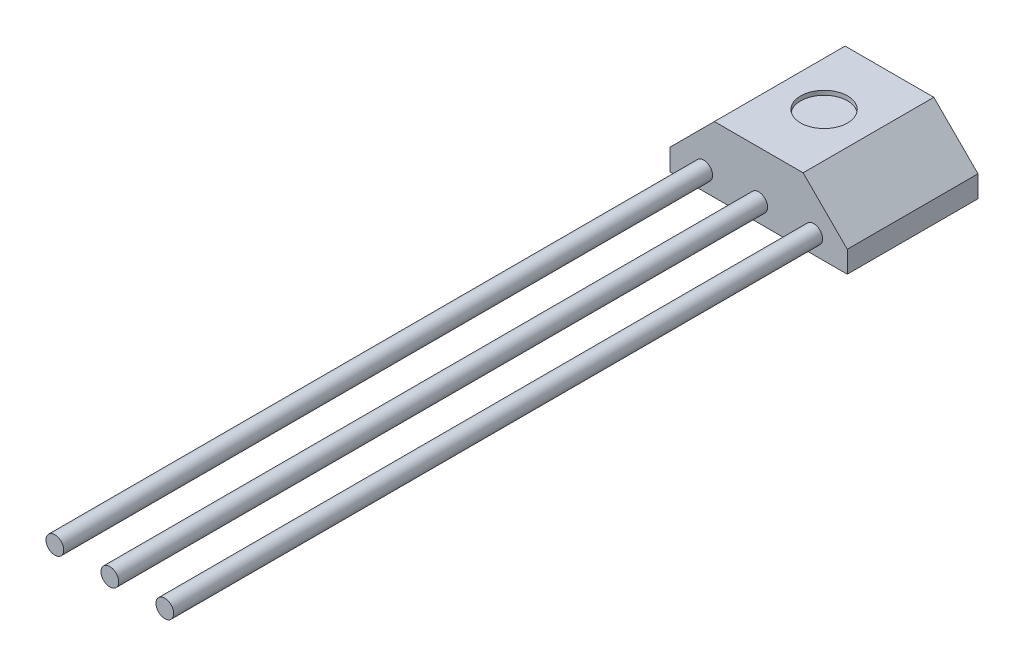
ISO-10303-21;
HEADER;
FILE_DESCRIPTION(('STEP AP214'),'2;1');
FILE_NAME('part.step','',(''),(''),'','','');
FILE_SCHEMA(('AUTOMOTIVE_DESIGN { 1 0 10303 214 1 1 1 1 }'));
ENDSEC;
DATA;
#1=APPLICATION_CONTEXT('core data for automotive mechanical design processes');
#2=APPLICATION_PROTOCOL_DEFINITION('international standard','automotive_design',2000,#1);
#3=PRODUCT_CONTEXT('',#1,'mechanical');
#4=PRODUCT('Part','Part','',(#3));
#5=PRODUCT_RELATED_PRODUCT_CATEGORY('part','',(#4));
#6=PRODUCT_DEFINITION_FORMATION('','',#4);
#7=PRODUCT_DEFINITION_CONTEXT('part definition',#1,'design');
#8=PRODUCT_DEFINITION('design','',#6,#7);
#9=PRODUCT_DEFINITION_SHAPE('','',#8);
#10=(LENGTH_UNIT() NAMED_UNIT(*) SI_UNIT(.MILLI.,.METRE.));
#11=(NAMED_UNIT(*) PLANE_ANGLE_UNIT() SI_UNIT($,.RADIAN.));
#12=(NAMED_UNIT(*) SI_UNIT($,.STERADIAN.) SOLID_ANGLE_UNIT());
#13=UNCERTAINTY_MEASURE_WITH_UNIT(LENGTH_MEASURE(1.E-05),#10,'distance_accuracy_value','');
#14=(GEOMETRIC_REPRESENTATION_CONTEXT(3) GLOBAL_UNCERTAINTY_ASSIGNED_CONTEXT((#13)) GLOBAL_UNIT_ASSIGNED_CONTEXT((#10,
#11,#12)) REPRESENTATION_CONTEXT('',''));
#15=CARTESIAN_POINT('',(0.,0.,0.));
#16=DIRECTION('',(0.,0.,1.));
#17=DIRECTION('',(1.,0.,0.));
#18=AXIS2_PLACEMENT_3D('',#15,#16,#17);
#19=CARTESIAN_POINT('',(7.67061052211858,30.6476317346096,14.99));
#20=DIRECTION('',(0.,0.,-1.));
#21=DIRECTION('',(-1.,0.,0.));
#22=AXIS2_PLACEMENT_3D('',#19,#20,#21);
#23=CYLINDRICAL_SURFACE('',#22,0.205);
#24=CARTESIAN_POINT('',(7.67061052211858,30.6476317346096,14.99));
#25=DIRECTION('',(0.,0.,1.));
#26=DIRECTION('',(1.,0.,0.));
#27=AXIS2_PLACEMENT_3D('',#24,#25,#26);
#28=CIRCLE('',#27,0.205);
#29=CARTESIAN_POINT('',(7.87561052211858,30.6476317346096,14.99));
#30=VERTEX_POINT('',#29);
#31=EDGE_CURVE('P0_E10',#30,#30,#28,.T.);
#32=ORIENTED_EDGE('',*,*,#31,.F.);
#33=EDGE_LOOP('',(#32));
#34=FACE_BOUND('',#33,.T.);
#35=CARTESIAN_POINT('',(7.67061052211858,30.6476317346096,0.));
#36=DIRECTION('',(0.,0.,1.));
#37=DIRECTION('',(1.,0.,0.));
#38=AXIS2_PLACEMENT_3D('',#35,#36,#37);
#39=CIRCLE('',#38,0.205);
#40=CARTESIAN_POINT('',(7.87561052211858,30.6476317346096,0.));
#41=VERTEX_POINT('',#40);
#42=EDGE_CURVE('P0_E18',#41,#41,#39,.T.);
#43=ORIENTED_EDGE('',*,*,#42,.T.);
#44=EDGE_LOOP('',(#43));
#45=FACE_BOUND('',#44,.T.);
#46=ADVANCED_FACE('P0_F15',(#34,#45),#23,.T.);
#47=CARTESIAN_POINT('',(6.40061052211856,30.9865106012478,14.99));
#48=DIRECTION('',(0.,0.,1.));
#49=DIRECTION('',(1.,0.,0.));
#50=AXIS2_PLACEMENT_3D('',#47,#48,#49);
#51=PLANE('',#50);
#52=ORIENTED_EDGE('',*,*,#31,.T.);
#53=EDGE_LOOP('',(#52));
#54=FACE_BOUND('',#53,.T.);
#55=ADVANCED_FACE('P0_F36',(#54),#51,.T.);
#56=CARTESIAN_POINT('',(6.40061052211856,30.9865106012478,0.));
#57=DIRECTION('',(0.,0.,1.));
#58=DIRECTION('',(1.,0.,0.));
#59=AXIS2_PLACEMENT_3D('',#56,#57,#58);
#60=PLANE('',#59);
#61=ORIENTED_EDGE('',*,*,#42,.F.);
#62=EDGE_LOOP('',(#61));
#63=FACE_BOUND('',#62,.T.);
#64=ADVANCED_FACE('P0_F34',(#63),#60,.F.);
#65=CLOSED_SHELL('',(#46,#55,#64));
#66=MANIFOLD_SOLID_BREP('P0_B1',#65);
#67=CARTESIAN_POINT('',(5.13061052211858,30.6476317346096,14.99));
#68=DIRECTION('',(0.,0.,-1.));
#69=DIRECTION('',(-1.,0.,0.));
#70=AXIS2_PLACEMENT_3D('',#67,#68,#69);
#71=CYLINDRICAL_SURFACE('',#70,0.205);
#72=CARTESIAN_POINT('',(5.13061052211858,30.6476317346096,14.99));
#73=DIRECTION('',(0.,0.,1.));
#74=DIRECTION('',(1.,0.,0.));
#75=AXIS2_PLACEMENT_3D('',#72,#73,#74);
#76=CIRCLE('',#75,0.205);
#77=CARTESIAN_POINT('',(5.33561052211858,30.6476317346096,14.99));
#78=VERTEX_POINT('',#77);
#79=EDGE_CURVE('P1_E10',#78,#78,#76,.T.);
#80=ORIENTED_EDGE('',*,*,#79,.F.);
#81=EDGE_LOOP('',(#80));
#82=FACE_BOUND('',#81,.T.);
#83=CARTESIAN_POINT('',(5.13061052211858,30.6476317346096,0.));
#84=DIRECTION('',(0.,0.,1.));
#85=DIRECTION('',(1.,0.,0.));
#86=AXIS2_PLACEMENT_3D('',#83,#84,#85);
#87=CIRCLE('',#86,0.205);
#88=CARTESIAN_POINT('',(5.33561052211858,30.6476317346096,0.));
#89=VERTEX_POINT('',#88);
#90=EDGE_CURVE('P1_E18',#89,#89,#87,.T.);
#91=ORIENTED_EDGE('',*,*,#90,.T.);
#92=EDGE_LOOP('',(#91));
#93=FACE_BOUND('',#92,.T.);
#94=ADVANCED_FACE('P1_F15',(#82,#93),#71,.T.);
#95=CARTESIAN_POINT('',(6.40061052211856,30.9865106012478,14.99));
#96=DIRECTION('',(0.,0.,1.));
#97=DIRECTION('',(1.,0.,0.));
#98=AXIS2_PLACEMENT_3D('',#95,#96,#97);
#99=PLANE('',#98);
#100=ORIENTED_EDGE('',*,*,#79,.T.);
#101=EDGE_LOOP('',(#100));
#102=FACE_BOUND('',#101,.T.);
#103=ADVANCED_FACE('P1_F36',(#102),#99,.T.);
#104=CARTESIAN_POINT('',(6.40061052211856,30.9865106012478,0.));
#105=DIRECTION('',(0.,0.,1.));
#106=DIRECTION('',(1.,0.,0.));
#107=AXIS2_PLACEMENT_3D('',#104,#105,#106);
#108=PLANE('',#107);
#109=ORIENTED_EDGE('',*,*,#90,.F.);
#110=EDGE_LOOP('',(#109));
#111=FACE_BOUND('',#110,.T.);
#112=ADVANCED_FACE('P1_F34',(#111),#108,.F.);
#113=CLOSED_SHELL('',(#94,#103,#112));
#114=MANIFOLD_SOLID_BREP('P1_B1',#113);
#115=CARTESIAN_POINT('',(6.40061052211856,30.6476317346096,14.99));
#116=DIRECTION('',(0.,0.,-1.));
#117=DIRECTION('',(-1.,0.,0.));
#118=AXIS2_PLACEMENT_3D('',#115,#116,#117);
#119=CYLINDRICAL_SURFACE('',#118,0.205);
#120=CARTESIAN_POINT('',(6.40061052211856,30.6476317346096,14.99));
#121=DIRECTION('',(0.,0.,1.));
#122=DIRECTION('',(1.,0.,0.));
#123=AXIS2_PLACEMENT_3D('',#120,#121,#122);
#124=CIRCLE('',#123,0.205);
#125=CARTESIAN_POINT('',(6.60561052211856,30.6476317346096,14.99));
#126=VERTEX_POINT('',#125);
#127=EDGE_CURVE('P2_E10',#126,#126,#124,.T.);
#128=ORIENTED_EDGE('',*,*,#127,.F.);
#129=EDGE_LOOP('',(#128));
#130=FACE_BOUND('',#129,.T.);
#131=CARTESIAN_POINT('',(6.40061052211856,30.6476317346096,0.));
#132=DIRECTION('',(0.,0.,1.));
#133=DIRECTION('',(1.,0.,0.));
#134=AXIS2_PLACEMENT_3D('',#131,#132,#133);
#135=CIRCLE('',#134,0.205);
#136=CARTESIAN_POINT('',(6.60561052211856,30.6476317346096,0.));
#137=VERTEX_POINT('',#136);
#138=EDGE_CURVE('P2_E18',#137,#137,#135,.T.);
#139=ORIENTED_EDGE('',*,*,#138,.T.);
#140=EDGE_LOOP('',(#139));
#141=FACE_BOUND('',#140,.T.);
#142=ADVANCED_FACE('P2_F15',(#130,#141),#119,.T.);
#143=CARTESIAN_POINT('',(6.40061052211856,30.9865106012478,14.99));
#144=DIRECTION('',(0.,0.,1.));
#145=DIRECTION('',(1.,0.,0.));
#146=AXIS2_PLACEMENT_3D('',#143,#144,#145);
#147=PLANE('',#146);
#148=ORIENTED_EDGE('',*,*,#127,.T.);
#149=EDGE_LOOP('',(#148));
#150=FACE_BOUND('',#149,.T.);
#151=ADVANCED_FACE('P2_F35',(#150),#147,.T.);
#152=CARTESIAN_POINT('',(6.40061052211856,30.9865106012478,0.));
#153=DIRECTION('',(0.,0.,1.));
#154=DIRECTION('',(1.,0.,0.));
#155=AXIS2_PLACEMENT_3D('',#152,#153,#154);
#156=PLANE('',#155);
#157=ORIENTED_EDGE('',*,*,#138,.F.);
#158=EDGE_LOOP('',(#157));
#159=FACE_BOUND('',#158,.T.);
#160=ADVANCED_FACE('P2_F33',(#159),#156,.F.);
#161=CLOSED_SHELL('',(#142,#151,#160));
#162=MANIFOLD_SOLID_BREP('P2_B1',#161);
#163=CARTESIAN_POINT('',(6.44503934159751,30.2265106012478,-3.02));
#164=DIRECTION('',(0.,-1.,0.));
#165=DIRECTION('',(1.,0.,0.));
#166=AXIS2_PLACEMENT_3D('',#163,#164,#165);
#167=PLANE('',#166);
#168=DIRECTION('',(1.,0.,0.));
#169=VECTOR('',#168,1.);
#170=CARTESIAN_POINT('',(6.44503934159751,30.2265106012478,0.));
#171=LINE('',#170,#169);
#172=CARTESIAN_POINT('',(4.35561052211856,30.2265106012478,0.));
#173=VERTEX_POINT('',#172);
#174=CARTESIAN_POINT('',(8.44561052211856,30.2265106012478,0.));
#175=VERTEX_POINT('',#174);
#176=EDGE_CURVE('P3_E210',#173,#175,#171,.T.);
#177=ORIENTED_EDGE('',*,*,#176,.F.);
#178=DIRECTION('',(0.,0.,1.));
#179=VECTOR('',#178,1.);
#180=CARTESIAN_POINT('',(4.35561052211856,30.2265106012478,-3.02));
#181=LINE('',#180,#179);
#182=CARTESIAN_POINT('',(4.35561052211856,30.2265106012478,-3.02));
#183=VERTEX_POINT('',#182);
#184=EDGE_CURVE('P3_E26',#183,#173,#181,.T.);
#185=ORIENTED_EDGE('',*,*,#184,.F.);
#186=DIRECTION('',(1.,0.,0.));
#187=VECTOR('',#186,1.);
#188=CARTESIAN_POINT('',(6.44503934159751,30.2265106012478,-3.02));
#189=LINE('',#188,#187);
#190=CARTESIAN_POINT('',(8.44561052211856,30.2265106012478,-3.02));
#191=VERTEX_POINT('',#190);
#192=EDGE_CURVE('P3_E186',#183,#191,#189,.T.);
#193=ORIENTED_EDGE('',*,*,#192,.T.);
#194=DIRECTION('',(0.,0.,1.));
#195=VECTOR('',#194,1.);
#196=CARTESIAN_POINT('',(8.44561052211856,30.2265106012478,-3.02));
#197=LINE('',#196,#195);
#198=EDGE_CURVE('P3_E233',#191,#175,#197,.T.);
#199=ORIENTED_EDGE('',*,*,#198,.T.);
#200=EDGE_LOOP('',(#177,#185,#193,#199));
#201=FACE_BOUND('',#200,.T.);
#202=DIRECTION('',(1.,0.,0.));
#203=VECTOR('',#202,1.);
#204=CARTESIAN_POINT('',(6.40061052211856,30.2265106012478,-2.47480696998536));
#205=LINE('',#204,#203);
#206=CARTESIAN_POINT('',(4.79791965335607,30.2265106012478,-2.47480696998536));
#207=VERTEX_POINT('',#206);
#208=CARTESIAN_POINT('',(8.00330139088105,30.2265106012478,-2.47480696998536));
#209=VERTEX_POINT('',#208);
#210=EDGE_CURVE('P3_E158',#207,#209,#205,.T.);
#211=ORIENTED_EDGE('',*,*,#210,.F.);
#212=DIRECTION('',(0.,0.,1.));
#213=VECTOR('',#212,1.);
#214=CARTESIAN_POINT('',(4.79791965335607,30.2265106012478,-1.41354801598936));
#215=LINE('',#214,#213);
#216=CARTESIAN_POINT('',(4.79791965335607,30.2265106012478,-0.352289061993361));
#217=VERTEX_POINT('',#216);
#218=EDGE_CURVE('P3_E38',#207,#217,#215,.T.);
#219=ORIENTED_EDGE('',*,*,#218,.T.);
#220=DIRECTION('',(1.,0.,0.));
#221=VECTOR('',#220,1.);
#222=CARTESIAN_POINT('',(6.40061052211856,30.2265106012478,-0.352289061993361));
#223=LINE('',#222,#221);
#224=CARTESIAN_POINT('',(8.00330139088105,30.2265106012478,-0.352289061993361));
#225=VERTEX_POINT('',#224);
#226=EDGE_CURVE('P3_E45',#217,#225,#223,.T.);
#227=ORIENTED_EDGE('',*,*,#226,.T.);
#228=DIRECTION('',(0.,0.,1.));
#229=VECTOR('',#228,1.);
#230=CARTESIAN_POINT('',(8.00330139088105,30.2265106012478,-1.41354801598936));
#231=LINE('',#230,#229);
#232=EDGE_CURVE('P3_E149',#209,#225,#231,.T.);
#233=ORIENTED_EDGE('',*,*,#232,.F.);
#234=EDGE_LOOP('',(#211,#219,#227,#233));
#235=FACE_BOUND('',#234,.T.);
#236=ADVANCED_FACE('P3_F17',(#201,#235),#167,.T.);
#237=CARTESIAN_POINT('',(4.83826239908289,31.2091624782122,-3.02));
#238=DIRECTION('',(-0.707106781186548,0.707106781186547,0.));
#239=DIRECTION('',(-0.707106781186547,-0.707106781186548,0.));
#240=AXIS2_PLACEMENT_3D('',#237,#238,#239);
#241=PLANE('',#240);
#242=DIRECTION('',(-0.707106781186547,-0.707106781186548,0.));
#243=VECTOR('',#242,1.);
#244=CARTESIAN_POINT('',(4.83826239908289,31.2091624782122,0.));
#245=LINE('',#244,#243);
#246=CARTESIAN_POINT('',(5.37561052211856,31.7465106012478,0.));
#247=VERTEX_POINT('',#246);
#248=CARTESIAN_POINT('',(4.35561052211856,30.7265106012478,0.));
#249=VERTEX_POINT('',#248);
#250=EDGE_CURVE('P3_E173',#247,#249,#245,.T.);
#251=ORIENTED_EDGE('',*,*,#250,.F.);
#252=DIRECTION('',(0.,0.,1.));
#253=VECTOR('',#252,1.);
#254=CARTESIAN_POINT('',(5.37561052211856,31.7465106012478,-3.02));
#255=LINE('',#254,#253);
#256=CARTESIAN_POINT('',(5.37561052211856,31.7465106012478,-3.02));
#257=VERTEX_POINT('',#256);
#258=EDGE_CURVE('P3_E202',#257,#247,#255,.T.);
#259=ORIENTED_EDGE('',*,*,#258,.F.);
#260=DIRECTION('',(-0.707106781186547,-0.707106781186548,0.));
#261=VECTOR('',#260,1.);
#262=CARTESIAN_POINT('',(4.83826239908289,31.2091624782122,-3.02));
#263=LINE('',#262,#261);
#264=CARTESIAN_POINT('',(4.35561052211856,30.7265106012478,-3.02));
#265=VERTEX_POINT('',#264);
#266=EDGE_CURVE('P3_E177',#257,#265,#263,.T.);
#267=ORIENTED_EDGE('',*,*,#266,.T.);
#268=DIRECTION('',(0.,0.,1.));
#269=VECTOR('',#268,1.);
#270=CARTESIAN_POINT('',(4.35561052211856,30.7265106012478,-3.02));
#271=LINE('',#270,#269);
#272=EDGE_CURVE('P3_E11',#265,#249,#271,.T.);
#273=ORIENTED_EDGE('',*,*,#272,.T.);
#274=EDGE_LOOP('',(#251,#259,#267,#273));
#275=FACE_BOUND('',#274,.T.);
#276=ADVANCED_FACE('P3_F19',(#275),#241,.T.);
#277=CARTESIAN_POINT('',(4.35561052211856,29.9818166694562,-3.02));
#278=DIRECTION('',(-1.,0.,0.));
#279=DIRECTION('',(0.,0.,1.));
#280=AXIS2_PLACEMENT_3D('',#277,#278,#279);
#281=PLANE('',#280);
#282=DIRECTION('',(0.,-1.,0.));
#283=VECTOR('',#282,1.);
#284=CARTESIAN_POINT('',(4.35561052211856,29.9818166694562,0.));
#285=LINE('',#284,#283);
#286=EDGE_CURVE('P3_E206',#249,#173,#285,.T.);
#287=ORIENTED_EDGE('',*,*,#286,.F.);
#288=ORIENTED_EDGE('',*,*,#272,.F.);
#289=DIRECTION('',(0.,-1.,0.));
#290=VECTOR('',#289,1.);
#291=CARTESIAN_POINT('',(4.35561052211856,29.9818166694562,-3.02));
#292=LINE('',#291,#290);
#293=EDGE_CURVE('P3_E181',#265,#183,#292,.T.);
#294=ORIENTED_EDGE('',*,*,#293,.T.);
#295=ORIENTED_EDGE('',*,*,#184,.T.);
#296=EDGE_LOOP('',(#287,#288,#294,#295));
#297=FACE_BOUND('',#296,.T.);
#298=ADVANCED_FACE('P3_F240',(#297),#281,.T.);
#299=CARTESIAN_POINT('',(8.44561052211856,30.0029307879281,-3.02));
#300=DIRECTION('',(1.,0.,0.));
#301=DIRECTION('',(0.,0.,-1.));
#302=AXIS2_PLACEMENT_3D('',#299,#300,#301);
#303=PLANE('',#302);
#304=DIRECTION('',(0.,1.,0.));
#305=VECTOR('',#304,1.);
#306=CARTESIAN_POINT('',(8.44561052211856,30.0029307879281,0.));
#307=LINE('',#306,#305);
#308=CARTESIAN_POINT('',(8.44561052211856,30.7265106012478,0.));
#309=VERTEX_POINT('',#308);
#310=EDGE_CURVE('P3_E214',#175,#309,#307,.T.);
#311=ORIENTED_EDGE('',*,*,#310,.F.);
#312=ORIENTED_EDGE('',*,*,#198,.F.);
#313=DIRECTION('',(0.,1.,0.));
#314=VECTOR('',#313,1.);
#315=CARTESIAN_POINT('',(8.44561052211856,30.0029307879281,-3.02));
#316=LINE('',#315,#314);
#317=CARTESIAN_POINT('',(8.44561052211856,30.7265106012478,-3.02));
#318=VERTEX_POINT('',#317);
#319=EDGE_CURVE('P3_E190',#191,#318,#316,.T.);
#320=ORIENTED_EDGE('',*,*,#319,.T.);
#321=DIRECTION('',(0.,0.,1.));
#322=VECTOR('',#321,1.);
#323=CARTESIAN_POINT('',(8.44561052211856,30.7265106012478,-3.02));
#324=LINE('',#323,#322);
#325=EDGE_CURVE('P3_E230',#318,#309,#324,.T.);
#326=ORIENTED_EDGE('',*,*,#325,.T.);
#327=EDGE_LOOP('',(#311,#312,#320,#326));
#328=FACE_BOUND('',#327,.T.);
#329=ADVANCED_FACE('P3_F257',(#328),#303,.T.);
#330=CARTESIAN_POINT('',(7.83431157235327,31.3378095510132,-3.02));
#331=DIRECTION('',(0.707106781186547,0.707106781186548,0.));
#332=DIRECTION('',(-0.707106781186548,0.707106781186547,0.));
#333=AXIS2_PLACEMENT_3D('',#330,#331,#332);
#334=PLANE('',#333);
#335=DIRECTION('',(-0.707106781186548,0.707106781186547,0.));
#336=VECTOR('',#335,1.);
#337=CARTESIAN_POINT('',(7.83431157235327,31.3378095510132,0.));
#338=LINE('',#337,#336);
#339=CARTESIAN_POINT('',(7.42561052211856,31.7465106012478,0.));
#340=VERTEX_POINT('',#339);
#341=EDGE_CURVE('P3_E218',#309,#340,#338,.T.);
#342=ORIENTED_EDGE('',*,*,#341,.F.);
#343=ORIENTED_EDGE('',*,*,#325,.F.);
#344=DIRECTION('',(-0.707106781186548,0.707106781186547,0.));
#345=VECTOR('',#344,1.);
#346=CARTESIAN_POINT('',(7.83431157235327,31.3378095510132,-3.02));
#347=LINE('',#346,#345);
#348=CARTESIAN_POINT('',(7.42561052211856,31.7465106012478,-3.02));
#349=VERTEX_POINT('',#348);
#350=EDGE_CURVE('P3_E194',#318,#349,#347,.T.);
#351=ORIENTED_EDGE('',*,*,#350,.T.);
#352=DIRECTION('',(0.,0.,1.));
#353=VECTOR('',#352,1.);
#354=CARTESIAN_POINT('',(7.42561052211856,31.7465106012478,-3.02));
#355=LINE('',#354,#353);
#356=EDGE_CURVE('P3_E227',#349,#340,#355,.T.);
#357=ORIENTED_EDGE('',*,*,#356,.T.);
#358=EDGE_LOOP('',(#342,#343,#351,#357));
#359=FACE_BOUND('',#358,.T.);
#360=ADVANCED_FACE('P3_F260',(#359),#334,.T.);
#361=CARTESIAN_POINT('',(6.42456134884818,31.7465106012478,-3.02));
#362=DIRECTION('',(0.,1.,0.));
#363=DIRECTION('',(-1.,0.,0.));
#364=AXIS2_PLACEMENT_3D('',#361,#362,#363);
#365=PLANE('',#364);
#366=CARTESIAN_POINT('',(6.40061052211856,31.7465106012478,-1.51));
#367=DIRECTION('',(0.,1.,0.));
#368=DIRECTION('',(-1.,0.,0.));
#369=AXIS2_PLACEMENT_3D('',#366,#367,#368);
#370=CIRCLE('',#369,0.54185155627086);
#371=CARTESIAN_POINT('',(5.8587589658477,31.7465106012478,-1.51));
#372=VERTEX_POINT('',#371);
#373=EDGE_CURVE('P3_E128',#372,#372,#370,.T.);
#374=ORIENTED_EDGE('',*,*,#373,.F.);
#375=EDGE_LOOP('',(#374));
#376=FACE_BOUND('',#375,.T.);
#377=DIRECTION('',(-1.,0.,0.));
#378=VECTOR('',#377,1.);
#379=CARTESIAN_POINT('',(6.42456134884818,31.7465106012478,0.));
#380=LINE('',#379,#378);
#381=EDGE_CURVE('P3_E182',#340,#247,#380,.T.);
#382=ORIENTED_EDGE('',*,*,#381,.F.);
#383=ORIENTED_EDGE('',*,*,#356,.F.);
#384=DIRECTION('',(-1.,0.,0.));
#385=VECTOR('',#384,1.);
#386=CARTESIAN_POINT('',(6.42456134884818,31.7465106012478,-3.02));
#387=LINE('',#386,#385);
#388=EDGE_CURVE('P3_E198',#349,#257,#387,.T.);
#389=ORIENTED_EDGE('',*,*,#388,.T.);
#390=ORIENTED_EDGE('',*,*,#258,.T.);
#391=EDGE_LOOP('',(#382,#383,#389,#390));
#392=FACE_BOUND('',#391,.T.);
#393=ADVANCED_FACE('P3_F262',(#376,#392),#365,.T.);
#394=CARTESIAN_POINT('',(6.40061052211856,30.9865106012478,-3.02));
#395=DIRECTION('',(0.,0.,1.));
#396=DIRECTION('',(1.,0.,0.));
#397=AXIS2_PLACEMENT_3D('',#394,#395,#396);
#398=PLANE('',#397);
#399=ORIENTED_EDGE('',*,*,#266,.F.);
#400=ORIENTED_EDGE('',*,*,#388,.F.);
#401=ORIENTED_EDGE('',*,*,#350,.F.);
#402=ORIENTED_EDGE('',*,*,#319,.F.);
#403=ORIENTED_EDGE('',*,*,#192,.F.);
#404=ORIENTED_EDGE('',*,*,#293,.F.);
#405=EDGE_LOOP('',(#399,#400,#401,#402,#403,#404));
#406=FACE_BOUND('',#405,.T.);
#407=ADVANCED_FACE('P3_F252',(#406),#398,.F.);
#408=CARTESIAN_POINT('',(6.40061052211856,30.9865106012478,0.));
#409=DIRECTION('',(0.,0.,1.));
#410=DIRECTION('',(1.,0.,0.));
#411=AXIS2_PLACEMENT_3D('',#408,#409,#410);
#412=PLANE('',#411);
#413=ORIENTED_EDGE('',*,*,#250,.T.);
#414=ORIENTED_EDGE('',*,*,#286,.T.);
#415=ORIENTED_EDGE('',*,*,#176,.T.);
#416=ORIENTED_EDGE('',*,*,#310,.T.);
#417=ORIENTED_EDGE('',*,*,#341,.T.);
#418=ORIENTED_EDGE('',*,*,#381,.T.);
#419=EDGE_LOOP('',(#413,#414,#415,#416,#417,#418));
#420=FACE_BOUND('',#419,.T.);
#421=ADVANCED_FACE('P3_F246',(#420),#412,.T.);
#422=CARTESIAN_POINT('',(6.40061052211856,31.6465106012478,-1.51));
#423=DIRECTION('',(0.,1.,0.));
#424=DIRECTION('',(-1.,0.,0.));
#425=AXIS2_PLACEMENT_3D('',#422,#423,#424);
#426=CYLINDRICAL_SURFACE('',#425,0.54185155627086);
#427=CARTESIAN_POINT('',(6.40061052211856,31.6465106012478,-1.51));
#428=DIRECTION('',(0.,1.,0.));
#429=DIRECTION('',(-1.,0.,0.));
#430=AXIS2_PLACEMENT_3D('',#427,#428,#429);
#431=CIRCLE('',#430,0.54185155627086);
#432=CARTESIAN_POINT('',(5.8587589658477,31.6465106012478,-1.51));
#433=VERTEX_POINT('',#432);
#434=EDGE_CURVE('P3_E169',#433,#433,#431,.T.);
#435=ORIENTED_EDGE('',*,*,#434,.F.);
#436=EDGE_LOOP('',(#435));
#437=FACE_BOUND('',#436,.T.);
#438=ORIENTED_EDGE('',*,*,#373,.T.);
#439=EDGE_LOOP('',(#438));
#440=FACE_BOUND('',#439,.T.);
#441=ADVANCED_FACE('P3_F318',(#437,#440),#426,.F.);
#442=CARTESIAN_POINT('',(6.40061052211856,31.6465106012478,-1.51));
#443=DIRECTION('',(0.,1.,0.));
#444=DIRECTION('',(-1.,0.,0.));
#445=AXIS2_PLACEMENT_3D('',#442,#443,#444);
#446=PLANE('',#445);
#447=ORIENTED_EDGE('',*,*,#434,.T.);
#448=EDGE_LOOP('',(#447));
#449=FACE_BOUND('',#448,.T.);
#450=ADVANCED_FACE('P3_F327',(#449),#446,.T.);
#451=CARTESIAN_POINT('',(4.79791965335607,30.2165106012478,-1.41354801598936));
#452=DIRECTION('',(-1.,0.,0.));
#453=DIRECTION('',(0.,-1.,0.));
#454=AXIS2_PLACEMENT_3D('',#451,#452,#453);
#455=PLANE('',#454);
#456=ORIENTED_EDGE('',*,*,#218,.F.);
#457=DIRECTION('',(0.,1.,0.));
#458=VECTOR('',#457,1.);
#459=CARTESIAN_POINT('',(4.79791965335607,30.2165106012478,-2.47480696998536));
#460=LINE('',#459,#458);
#461=CARTESIAN_POINT('',(4.79791965335607,30.2165106012478,-2.47480696998536));
#462=VERTEX_POINT('',#461);
#463=EDGE_CURVE('P3_E119',#462,#207,#460,.T.);
#464=ORIENTED_EDGE('',*,*,#463,.F.);
#465=DIRECTION('',(0.,0.,1.));
#466=VECTOR('',#465,1.);
#467=CARTESIAN_POINT('',(4.79791965335607,30.2165106012478,-1.41354801598936));
#468=LINE('',#467,#466);
#469=CARTESIAN_POINT('',(4.79791965335607,30.2165106012478,-0.352289061993361));
#470=VERTEX_POINT('',#469);
#471=EDGE_CURVE('P3_E123',#462,#470,#468,.T.);
#472=ORIENTED_EDGE('',*,*,#471,.T.);
#473=DIRECTION('',(0.,1.,0.));
#474=VECTOR('',#473,1.);
#475=CARTESIAN_POINT('',(4.79791965335607,30.2165106012478,-0.352289061993361));
#476=LINE('',#475,#474);
#477=EDGE_CURVE('P3_E155',#470,#217,#476,.T.);
#478=ORIENTED_EDGE('',*,*,#477,.T.);
#479=EDGE_LOOP('',(#456,#464,#472,#478));
#480=FACE_BOUND('',#479,.T.);
#481=ADVANCED_FACE('P3_F121',(#480),#455,.T.);
#482=CARTESIAN_POINT('',(6.40061052211856,30.2165106012478,-2.47480696998536));
#483=DIRECTION('',(0.,0.,1.));
#484=DIRECTION('',(1.,0.,0.));
#485=AXIS2_PLACEMENT_3D('',#482,#483,#484);
#486=PLANE('',#485);
#487=ORIENTED_EDGE('',*,*,#210,.T.);
#488=DIRECTION('',(0.,1.,0.));
#489=VECTOR('',#488,1.);
#490=CARTESIAN_POINT('',(8.00330139088105,30.2165106012478,-2.47480696998536));
#491=LINE('',#490,#489);
#492=CARTESIAN_POINT('',(8.00330139088105,30.2165106012478,-2.47480696998536));
#493=VERTEX_POINT('',#492);
#494=EDGE_CURVE('P3_E129',#493,#209,#491,.T.);
#495=ORIENTED_EDGE('',*,*,#494,.F.);
#496=DIRECTION('',(1.,0.,0.));
#497=VECTOR('',#496,1.);
#498=CARTESIAN_POINT('',(6.40061052211856,30.2165106012478,-2.47480696998536));
#499=LINE('',#498,#497);
#500=EDGE_CURVE('P3_E132',#462,#493,#499,.T.);
#501=ORIENTED_EDGE('',*,*,#500,.F.);
#502=ORIENTED_EDGE('',*,*,#463,.T.);
#503=EDGE_LOOP('',(#487,#495,#501,#502));
#504=FACE_BOUND('',#503,.T.);
#505=ADVANCED_FACE('P3_F133',(#504),#486,.F.);
#506=CARTESIAN_POINT('',(8.00330139088105,30.2165106012478,-1.41354801598936));
#507=DIRECTION('',(-1.,0.,0.));
#508=DIRECTION('',(0.,-1.,0.));
#509=AXIS2_PLACEMENT_3D('',#506,#507,#508);
#510=PLANE('',#509);
#511=ORIENTED_EDGE('',*,*,#232,.T.);
#512=DIRECTION('',(0.,1.,0.));
#513=VECTOR('',#512,1.);
#514=CARTESIAN_POINT('',(8.00330139088105,30.2165106012478,-0.352289061993361));
#515=LINE('',#514,#513);
#516=CARTESIAN_POINT('',(8.00330139088105,30.2165106012478,-0.352289061993361));
#517=VERTEX_POINT('',#516);
#518=EDGE_CURVE('P3_E164',#517,#225,#515,.T.);
#519=ORIENTED_EDGE('',*,*,#518,.F.);
#520=DIRECTION('',(0.,0.,1.));
#521=VECTOR('',#520,1.);
#522=CARTESIAN_POINT('',(8.00330139088105,30.2165106012478,-1.41354801598936));
#523=LINE('',#522,#521);
#524=EDGE_CURVE('P3_E138',#493,#517,#523,.T.);
#525=ORIENTED_EDGE('',*,*,#524,.F.);
#526=ORIENTED_EDGE('',*,*,#494,.T.);
#527=EDGE_LOOP('',(#511,#519,#525,#526));
#528=FACE_BOUND('',#527,.T.);
#529=ADVANCED_FACE('P3_F357',(#528),#510,.F.);
#530=CARTESIAN_POINT('',(6.40061052211856,30.2165106012478,-0.352289061993361));
#531=DIRECTION('',(0.,0.,1.));
#532=DIRECTION('',(1.,0.,0.));
#533=AXIS2_PLACEMENT_3D('',#530,#531,#532);
#534=PLANE('',#533);
#535=ORIENTED_EDGE('',*,*,#226,.F.);
#536=ORIENTED_EDGE('',*,*,#477,.F.);
#537=DIRECTION('',(1.,0.,0.));
#538=VECTOR('',#537,1.);
#539=CARTESIAN_POINT('',(6.40061052211856,30.2165106012478,-0.352289061993361));
#540=LINE('',#539,#538);
#541=EDGE_CURVE('P3_E142',#470,#517,#540,.T.);
#542=ORIENTED_EDGE('',*,*,#541,.T.);
#543=ORIENTED_EDGE('',*,*,#518,.T.);
#544=EDGE_LOOP('',(#535,#536,#542,#543));
#545=FACE_BOUND('',#544,.T.);
#546=ADVANCED_FACE('P3_F367',(#545),#534,.T.);
#547=CARTESIAN_POINT('',(6.40061052211856,30.2165106012478,-1.51));
#548=DIRECTION('',(0.,-1.,0.));
#549=DIRECTION('',(1.,0.,0.));
#550=AXIS2_PLACEMENT_3D('',#547,#548,#549);
#551=PLANE('',#550);
#552=ORIENTED_EDGE('',*,*,#471,.F.);
#553=ORIENTED_EDGE('',*,*,#500,.T.);
#554=ORIENTED_EDGE('',*,*,#524,.T.);
#555=ORIENTED_EDGE('',*,*,#541,.F.);
#556=EDGE_LOOP('',(#552,#553,#554,#555));
#557=FACE_BOUND('',#556,.T.);
#558=ADVANCED_FACE('P3_F140',(#557),#551,.T.);
#559=CLOSED_SHELL('',(#236,#276,#298,#329,#360,#393,#407,#421,#441,#450,#481,#505,#529,#546,#558));
#560=MANIFOLD_SOLID_BREP('P3_B1',#559);
#561=ADVANCED_BREP_SHAPE_REPRESENTATION('',(#18,#66,#114,#162,#560),#14);
#562=SHAPE_DEFINITION_REPRESENTATION(#9,#561);
ENDSEC;
END-ISO-10303-21;
